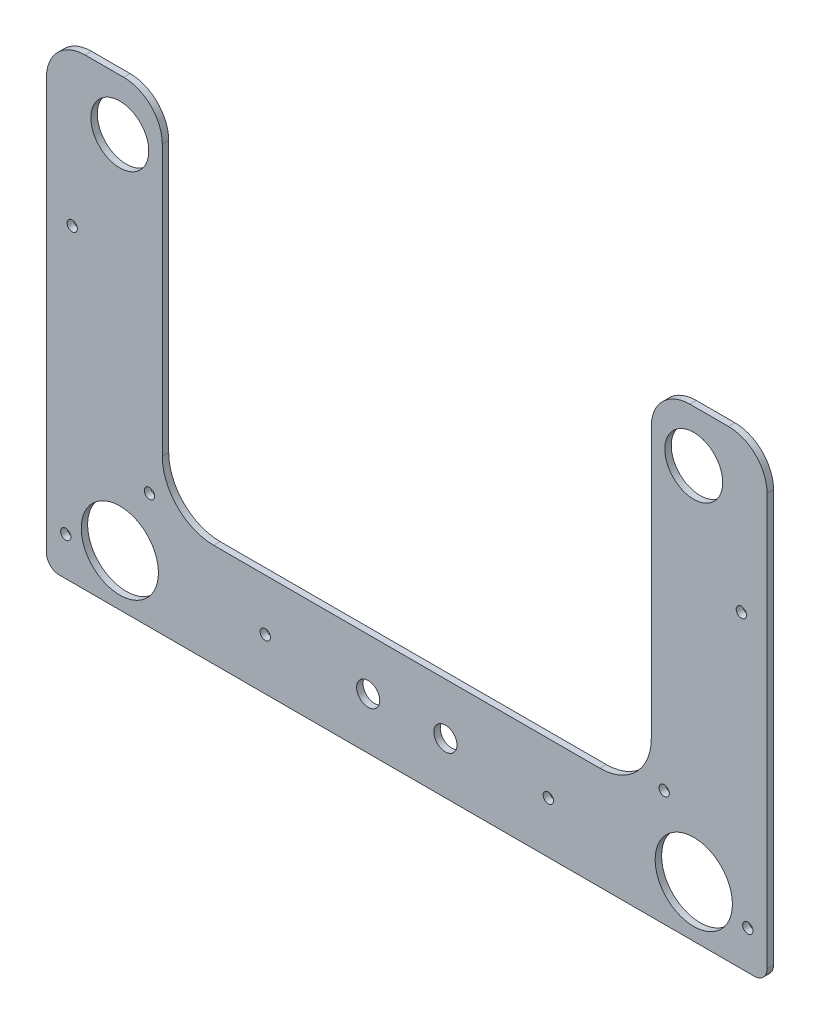
ISO-10303-21;
HEADER;
FILE_DESCRIPTION(('STEP AP214'),'2;1');
FILE_NAME('part.step','',(''),(''),'','','');
FILE_SCHEMA(('AUTOMOTIVE_DESIGN { 1 0 10303 214 1 1 1 1 }'));
ENDSEC;
DATA;
#1=APPLICATION_CONTEXT('core data for automotive mechanical design processes');
#2=APPLICATION_PROTOCOL_DEFINITION('international standard','automotive_design',2000,#1);
#3=PRODUCT_CONTEXT('',#1,'mechanical');
#4=PRODUCT('Part','Part','',(#3));
#5=PRODUCT_RELATED_PRODUCT_CATEGORY('part','',(#4));
#6=PRODUCT_DEFINITION_FORMATION('','',#4);
#7=PRODUCT_DEFINITION_CONTEXT('part definition',#1,'design');
#8=PRODUCT_DEFINITION('design','',#6,#7);
#9=PRODUCT_DEFINITION_SHAPE('','',#8);
#10=(LENGTH_UNIT() NAMED_UNIT(*) SI_UNIT(.MILLI.,.METRE.));
#11=(NAMED_UNIT(*) PLANE_ANGLE_UNIT() SI_UNIT($,.RADIAN.));
#12=(NAMED_UNIT(*) SI_UNIT($,.STERADIAN.) SOLID_ANGLE_UNIT());
#13=UNCERTAINTY_MEASURE_WITH_UNIT(LENGTH_MEASURE(1.E-05),#10,'distance_accuracy_value','');
#14=(GEOMETRIC_REPRESENTATION_CONTEXT(3) GLOBAL_UNCERTAINTY_ASSIGNED_CONTEXT((#13)) GLOBAL_UNIT_ASSIGNED_CONTEXT((#10,
#11,#12)) REPRESENTATION_CONTEXT('',''));
#15=CARTESIAN_POINT('',(0.,0.,0.));
#16=DIRECTION('',(0.,0.,1.));
#17=DIRECTION('',(1.,0.,0.));
#18=AXIS2_PLACEMENT_3D('',#15,#16,#17);
#19=CARTESIAN_POINT('',(165.1,6.35,3.175));
#20=DIRECTION('',(0.,0.,1.));
#21=DIRECTION('',(1.,0.,0.));
#22=AXIS2_PLACEMENT_3D('',#19,#20,#21);
#23=PLANE('',#22);
#24=DIRECTION('',(0.,1.,0.));
#25=VECTOR('',#24,1.);
#26=CARTESIAN_POINT('',(177.8,-6.35,3.175));
#27=LINE('',#26,#25);
#28=CARTESIAN_POINT('',(177.8,-222.25,3.175));
#29=VERTEX_POINT('',#28);
#30=CARTESIAN_POINT('',(177.8,-19.05,3.175));
#31=VERTEX_POINT('',#30);
#32=EDGE_CURVE('E165',#29,#31,#27,.T.);
#33=ORIENTED_EDGE('',*,*,#32,.T.);
#34=CARTESIAN_POINT('',(158.75,-19.05,3.175));
#35=DIRECTION('',(0.,0.,1.));
#36=DIRECTION('',(1.,0.,0.));
#37=AXIS2_PLACEMENT_3D('',#34,#35,#36);
#38=CIRCLE('',#37,19.05);
#39=CARTESIAN_POINT('',(158.75,0.,3.175));
#40=VERTEX_POINT('',#39);
#41=EDGE_CURVE('E279',#31,#40,#38,.T.);
#42=ORIENTED_EDGE('',*,*,#41,.T.);
#43=DIRECTION('',(1.,0.,0.));
#44=VECTOR('',#43,1.);
#45=CARTESIAN_POINT('',(-177.8,0.,3.175));
#46=LINE('',#45,#44);
#47=CARTESIAN_POINT('',(139.7,0.,3.175));
#48=VERTEX_POINT('',#47);
#49=EDGE_CURVE('E665',#48,#40,#46,.T.);
#50=ORIENTED_EDGE('',*,*,#49,.F.);
#51=CARTESIAN_POINT('',(139.7,-19.05,3.175));
#52=DIRECTION('',(0.,0.,1.));
#53=DIRECTION('',(1.,0.,0.));
#54=AXIS2_PLACEMENT_3D('',#51,#52,#53);
#55=CIRCLE('',#54,19.05);
#56=CARTESIAN_POINT('',(120.65,-19.0500000000001,3.175));
#57=VERTEX_POINT('',#56);
#58=EDGE_CURVE('E162',#48,#57,#55,.T.);
#59=ORIENTED_EDGE('',*,*,#58,.T.);
#60=DIRECTION('',(0.,-1.,0.));
#61=VECTOR('',#60,1.);
#62=CARTESIAN_POINT('',(120.65,6.35,3.175));
#63=LINE('',#62,#61);
#64=CARTESIAN_POINT('',(120.65,-152.4,3.175));
#65=VERTEX_POINT('',#64);
#66=EDGE_CURVE('E153',#57,#65,#63,.T.);
#67=ORIENTED_EDGE('',*,*,#66,.T.);
#68=CARTESIAN_POINT('',(95.25,-152.4,3.175));
#69=DIRECTION('',(0.,0.,-1.));
#70=DIRECTION('',(1.,0.,0.));
#71=AXIS2_PLACEMENT_3D('',#68,#69,#70);
#72=CIRCLE('',#71,25.4000000000002);
#73=CARTESIAN_POINT('',(95.25,-177.8,3.175));
#74=VERTEX_POINT('',#73);
#75=EDGE_CURVE('E158',#65,#74,#72,.T.);
#76=ORIENTED_EDGE('',*,*,#75,.T.);
#77=DIRECTION('',(-1.,0.,0.));
#78=VECTOR('',#77,1.);
#79=CARTESIAN_POINT('',(12.7,-177.8,3.175));
#80=LINE('',#79,#78);
#81=CARTESIAN_POINT('',(-95.25,-177.8,3.175));
#82=VERTEX_POINT('',#81);
#83=EDGE_CURVE('E183',#74,#82,#80,.T.);
#84=ORIENTED_EDGE('',*,*,#83,.T.);
#85=CARTESIAN_POINT('',(-95.25,-152.4,3.175));
#86=DIRECTION('',(0.,0.,-1.));
#87=DIRECTION('',(-1.,0.,0.));
#88=AXIS2_PLACEMENT_3D('',#85,#86,#87);
#89=CIRCLE('',#88,25.4);
#90=CARTESIAN_POINT('',(-120.65,-152.4,3.175));
#91=VERTEX_POINT('',#90);
#92=EDGE_CURVE('E186',#82,#91,#89,.T.);
#93=ORIENTED_EDGE('',*,*,#92,.T.);
#94=DIRECTION('',(0.,1.,0.));
#95=VECTOR('',#94,1.);
#96=CARTESIAN_POINT('',(-120.65,-152.4,3.175));
#97=LINE('',#96,#95);
#98=CARTESIAN_POINT('',(-120.65,-19.05,3.175));
#99=VERTEX_POINT('',#98);
#100=EDGE_CURVE('E192',#91,#99,#97,.T.);
#101=ORIENTED_EDGE('',*,*,#100,.T.);
#102=CARTESIAN_POINT('',(-139.7,-19.05,3.175));
#103=DIRECTION('',(0.,0.,1.));
#104=DIRECTION('',(1.,0.,0.));
#105=AXIS2_PLACEMENT_3D('',#102,#103,#104);
#106=CIRCLE('',#105,19.05);
#107=CARTESIAN_POINT('',(-139.7,0.,3.175));
#108=VERTEX_POINT('',#107);
#109=EDGE_CURVE('E274',#99,#108,#106,.T.);
#110=ORIENTED_EDGE('',*,*,#109,.T.);
#111=CARTESIAN_POINT('',(-158.75,0.,3.175));
#112=VERTEX_POINT('',#111);
#113=EDGE_CURVE('E317',#112,#108,#46,.T.);
#114=ORIENTED_EDGE('',*,*,#113,.F.);
#115=CARTESIAN_POINT('',(-158.75,-19.05,3.175));
#116=DIRECTION('',(0.,0.,1.));
#117=DIRECTION('',(1.,0.,0.));
#118=AXIS2_PLACEMENT_3D('',#115,#116,#117);
#119=CIRCLE('',#118,19.05);
#120=CARTESIAN_POINT('',(-177.8,-19.05,3.175));
#121=VERTEX_POINT('',#120);
#122=EDGE_CURVE('E271',#112,#121,#119,.T.);
#123=ORIENTED_EDGE('',*,*,#122,.T.);
#124=DIRECTION('',(0.,-1.,0.));
#125=VECTOR('',#124,1.);
#126=CARTESIAN_POINT('',(-177.8,-6.35,3.175));
#127=LINE('',#126,#125);
#128=CARTESIAN_POINT('',(-177.8,-222.25,3.175));
#129=VERTEX_POINT('',#128);
#130=EDGE_CURVE('E196',#121,#129,#127,.T.);
#131=ORIENTED_EDGE('',*,*,#130,.T.);
#132=CARTESIAN_POINT('',(-171.45,-222.25,3.175));
#133=DIRECTION('',(0.,0.,1.));
#134=DIRECTION('',(-1.,0.,0.));
#135=AXIS2_PLACEMENT_3D('',#132,#133,#134);
#136=CIRCLE('',#135,6.35000000000001);
#137=CARTESIAN_POINT('',(-171.45,-228.6,3.175));
#138=VERTEX_POINT('',#137);
#139=EDGE_CURVE('E199',#129,#138,#136,.T.);
#140=ORIENTED_EDGE('',*,*,#139,.T.);
#141=DIRECTION('',(1.,0.,0.));
#142=VECTOR('',#141,1.);
#143=CARTESIAN_POINT('',(-12.7,-228.6,3.175));
#144=LINE('',#143,#142);
#145=CARTESIAN_POINT('',(171.45,-228.6,3.175));
#146=VERTEX_POINT('',#145);
#147=EDGE_CURVE('E202',#138,#146,#144,.T.);
#148=ORIENTED_EDGE('',*,*,#147,.T.);
#149=CARTESIAN_POINT('',(171.45,-222.25,3.175));
#150=DIRECTION('',(0.,0.,1.));
#151=DIRECTION('',(1.,0.,0.));
#152=AXIS2_PLACEMENT_3D('',#149,#150,#151);
#153=CIRCLE('',#152,6.35000000000001);
#154=EDGE_CURVE('E205',#146,#29,#153,.T.);
#155=ORIENTED_EDGE('',*,*,#154,.T.);
#156=EDGE_LOOP('',(#33,#42,#50,#59,#67,#76,#84,#93,#101,#110,#114,#123,#131,#140,#148,#155));
#157=FACE_BOUND('',#156,.T.);
#158=CARTESIAN_POINT('',(165.1,-76.2,3.175));
#159=DIRECTION('',(0.,0.,1.));
#160=DIRECTION('',(-1.,0.,0.));
#161=AXIS2_PLACEMENT_3D('',#158,#159,#160);
#162=CIRCLE('',#161,2.53999999999998);
#163=CARTESIAN_POINT('',(162.56,-76.2,3.175));
#164=VERTEX_POINT('',#163);
#165=EDGE_CURVE('E671',#164,#164,#162,.T.);
#166=ORIENTED_EDGE('',*,*,#165,.F.);
#167=EDGE_LOOP('',(#166));
#168=FACE_BOUND('',#167,.T.);
#169=CARTESIAN_POINT('',(-165.1,-76.2,3.175));
#170=DIRECTION('',(0.,0.,1.));
#171=DIRECTION('',(1.,0.,0.));
#172=AXIS2_PLACEMENT_3D('',#169,#170,#171);
#173=CIRCLE('',#172,2.53999999999998);
#174=CARTESIAN_POINT('',(-162.56,-76.2,3.175));
#175=VERTEX_POINT('',#174);
#176=EDGE_CURVE('E679',#175,#175,#173,.T.);
#177=ORIENTED_EDGE('',*,*,#176,.F.);
#178=EDGE_LOOP('',(#177));
#179=FACE_BOUND('',#178,.T.);
#180=CARTESIAN_POINT('',(-19.05,-203.2,3.175));
#181=DIRECTION('',(0.,0.,1.));
#182=DIRECTION('',(1.,0.,0.));
#183=AXIS2_PLACEMENT_3D('',#180,#181,#182);
#184=CIRCLE('',#183,5.715);
#185=CARTESIAN_POINT('',(-13.335,-203.2,3.175));
#186=VERTEX_POINT('',#185);
#187=EDGE_CURVE('E695',#186,#186,#184,.T.);
#188=ORIENTED_EDGE('',*,*,#187,.F.);
#189=EDGE_LOOP('',(#188));
#190=FACE_BOUND('',#189,.T.);
#191=CARTESIAN_POINT('',(69.85,-203.2,3.175));
#192=DIRECTION('',(0.,0.,1.));
#193=DIRECTION('',(-1.,0.,0.));
#194=AXIS2_PLACEMENT_3D('',#191,#192,#193);
#195=CIRCLE('',#194,2.54000000000002);
#196=CARTESIAN_POINT('',(67.31,-203.2,3.175));
#197=VERTEX_POINT('',#196);
#198=EDGE_CURVE('E711',#197,#197,#195,.T.);
#199=ORIENTED_EDGE('',*,*,#198,.F.);
#200=EDGE_LOOP('',(#199));
#201=FACE_BOUND('',#200,.T.);
#202=CARTESIAN_POINT('',(19.05,-203.2,3.175));
#203=DIRECTION('',(0.,0.,1.));
#204=DIRECTION('',(-1.,0.,0.));
#205=AXIS2_PLACEMENT_3D('',#202,#203,#204);
#206=CIRCLE('',#205,5.715);
#207=CARTESIAN_POINT('',(13.335,-203.2,3.175));
#208=VERTEX_POINT('',#207);
#209=EDGE_CURVE('E727',#208,#208,#206,.T.);
#210=ORIENTED_EDGE('',*,*,#209,.F.);
#211=EDGE_LOOP('',(#210));
#212=FACE_BOUND('',#211,.T.);
#213=CARTESIAN_POINT('',(-141.605,-25.4,3.175));
#214=DIRECTION('',(0.,0.,1.));
#215=DIRECTION('',(-1.,0.,0.));
#216=AXIS2_PLACEMENT_3D('',#213,#214,#215);
#217=CIRCLE('',#216,14.2875);
#218=CARTESIAN_POINT('',(-155.8925,-25.4,3.175));
#219=VERTEX_POINT('',#218);
#220=EDGE_CURVE('E743',#219,#219,#217,.T.);
#221=ORIENTED_EDGE('',*,*,#220,.F.);
#222=EDGE_LOOP('',(#221));
#223=FACE_BOUND('',#222,.T.);
#224=CARTESIAN_POINT('',(141.605,-25.4,3.175));
#225=DIRECTION('',(0.,0.,1.));
#226=DIRECTION('',(1.,0.,0.));
#227=AXIS2_PLACEMENT_3D('',#224,#225,#226);
#228=CIRCLE('',#227,14.2875);
#229=CARTESIAN_POINT('',(155.8925,-25.4,3.175));
#230=VERTEX_POINT('',#229);
#231=EDGE_CURVE('E759',#230,#230,#228,.T.);
#232=ORIENTED_EDGE('',*,*,#231,.F.);
#233=EDGE_LOOP('',(#232));
#234=FACE_BOUND('',#233,.T.);
#235=CARTESIAN_POINT('',(-141.604999999999,-203.200000000001,3.175));
#236=DIRECTION('',(0.,0.,1.));
#237=DIRECTION('',(1.,0.,0.));
#238=AXIS2_PLACEMENT_3D('',#235,#236,#237);
#239=CIRCLE('',#238,19.05);
#240=CARTESIAN_POINT('',(-122.554999999999,-203.200000000001,3.175));
#241=VERTEX_POINT('',#240);
#242=EDGE_CURVE('E213',#241,#241,#239,.T.);
#243=ORIENTED_EDGE('',*,*,#242,.F.);
#244=EDGE_LOOP('',(#243));
#245=FACE_BOUND('',#244,.T.);
#246=CARTESIAN_POINT('',(127.,-171.45,3.175));
#247=DIRECTION('',(0.,0.,1.));
#248=DIRECTION('',(-1.,0.,0.));
#249=AXIS2_PLACEMENT_3D('',#246,#247,#248);
#250=CIRCLE('',#249,2.53999999999998);
#251=CARTESIAN_POINT('',(124.46,-171.45,3.175));
#252=VERTEX_POINT('',#251);
#253=EDGE_CURVE('E767',#252,#252,#250,.T.);
#254=ORIENTED_EDGE('',*,*,#253,.F.);
#255=EDGE_LOOP('',(#254));
#256=FACE_BOUND('',#255,.T.);
#257=CARTESIAN_POINT('',(-69.85,-203.2,3.175));
#258=DIRECTION('',(0.,0.,1.));
#259=DIRECTION('',(1.,0.,0.));
#260=AXIS2_PLACEMENT_3D('',#257,#258,#259);
#261=CIRCLE('',#260,2.54000000000002);
#262=CARTESIAN_POINT('',(-67.31,-203.2,3.175));
#263=VERTEX_POINT('',#262);
#264=EDGE_CURVE('E751',#263,#263,#261,.T.);
#265=ORIENTED_EDGE('',*,*,#264,.F.);
#266=EDGE_LOOP('',(#265));
#267=FACE_BOUND('',#266,.T.);
#268=CARTESIAN_POINT('',(-127.,-171.45,3.175));
#269=DIRECTION('',(0.,0.,1.));
#270=DIRECTION('',(1.,0.,0.));
#271=AXIS2_PLACEMENT_3D('',#268,#269,#270);
#272=CIRCLE('',#271,2.53999999999998);
#273=CARTESIAN_POINT('',(-124.46,-171.45,3.175));
#274=VERTEX_POINT('',#273);
#275=EDGE_CURVE('E735',#274,#274,#272,.T.);
#276=ORIENTED_EDGE('',*,*,#275,.F.);
#277=EDGE_LOOP('',(#276));
#278=FACE_BOUND('',#277,.T.);
#279=CARTESIAN_POINT('',(141.605,-203.2,3.175));
#280=DIRECTION('',(0.,0.,1.));
#281=DIRECTION('',(-1.,0.,0.));
#282=AXIS2_PLACEMENT_3D('',#279,#280,#281);
#283=CIRCLE('',#282,19.05);
#284=CARTESIAN_POINT('',(122.555,-203.2,3.175));
#285=VERTEX_POINT('',#284);
#286=EDGE_CURVE('E719',#285,#285,#283,.T.);
#287=ORIENTED_EDGE('',*,*,#286,.F.);
#288=EDGE_LOOP('',(#287));
#289=FACE_BOUND('',#288,.T.);
#290=CARTESIAN_POINT('',(-168.275,-209.55,3.175));
#291=DIRECTION('',(0.,0.,1.));
#292=DIRECTION('',(1.,0.,0.));
#293=AXIS2_PLACEMENT_3D('',#290,#291,#292);
#294=CIRCLE('',#293,2.53999999999998);
#295=CARTESIAN_POINT('',(-165.735,-209.55,3.175));
#296=VERTEX_POINT('',#295);
#297=EDGE_CURVE('E703',#296,#296,#294,.T.);
#298=ORIENTED_EDGE('',*,*,#297,.F.);
#299=EDGE_LOOP('',(#298));
#300=FACE_BOUND('',#299,.T.);
#301=CARTESIAN_POINT('',(168.275,-209.55,3.175));
#302=DIRECTION('',(0.,0.,1.));
#303=DIRECTION('',(-1.,0.,0.));
#304=AXIS2_PLACEMENT_3D('',#301,#302,#303);
#305=CIRCLE('',#304,2.53999999999998);
#306=CARTESIAN_POINT('',(165.735,-209.55,3.175));
#307=VERTEX_POINT('',#306);
#308=EDGE_CURVE('E687',#307,#307,#305,.T.);
#309=ORIENTED_EDGE('',*,*,#308,.F.);
#310=EDGE_LOOP('',(#309));
#311=FACE_BOUND('',#310,.T.);
#312=ADVANCED_FACE('F39',(#157,#168,#179,#190,#201,#212,#223,#234,#245,#256,#267,#278,#289,#300,
#311),#23,.T.);
#313=CARTESIAN_POINT('',(165.1,6.35,0.));
#314=DIRECTION('',(0.,0.,1.));
#315=DIRECTION('',(1.,0.,0.));
#316=AXIS2_PLACEMENT_3D('',#313,#314,#315);
#317=PLANE('',#316);
#318=DIRECTION('',(1.,0.,0.));
#319=VECTOR('',#318,1.);
#320=CARTESIAN_POINT('',(-177.8,0.,0.));
#321=LINE('',#320,#319);
#322=CARTESIAN_POINT('',(139.7,0.,0.));
#323=VERTEX_POINT('',#322);
#324=CARTESIAN_POINT('',(158.75,0.,0.));
#325=VERTEX_POINT('',#324);
#326=EDGE_CURVE('E326',#323,#325,#321,.T.);
#327=ORIENTED_EDGE('',*,*,#326,.T.);
#328=CARTESIAN_POINT('',(158.75,-19.05,0.));
#329=DIRECTION('',(0.,0.,1.));
#330=DIRECTION('',(1.,0.,0.));
#331=AXIS2_PLACEMENT_3D('',#328,#329,#330);
#332=CIRCLE('',#331,19.05);
#333=CARTESIAN_POINT('',(177.8,-19.05,0.));
#334=VERTEX_POINT('',#333);
#335=EDGE_CURVE('E295',#325,#334,#332,.F.);
#336=ORIENTED_EDGE('',*,*,#335,.T.);
#337=DIRECTION('',(0.,1.,0.));
#338=VECTOR('',#337,1.);
#339=CARTESIAN_POINT('',(177.8,-6.35,0.));
#340=LINE('',#339,#338);
#341=CARTESIAN_POINT('',(177.8,-222.25,0.));
#342=VERTEX_POINT('',#341);
#343=EDGE_CURVE('E239',#342,#334,#340,.T.);
#344=ORIENTED_EDGE('',*,*,#343,.F.);
#345=CARTESIAN_POINT('',(171.45,-222.25,0.));
#346=DIRECTION('',(0.,0.,1.));
#347=DIRECTION('',(1.,0.,0.));
#348=AXIS2_PLACEMENT_3D('',#345,#346,#347);
#349=CIRCLE('',#348,6.35000000000001);
#350=CARTESIAN_POINT('',(171.45,-228.6,0.));
#351=VERTEX_POINT('',#350);
#352=EDGE_CURVE('E236',#351,#342,#349,.T.);
#353=ORIENTED_EDGE('',*,*,#352,.F.);
#354=DIRECTION('',(1.,0.,0.));
#355=VECTOR('',#354,1.);
#356=CARTESIAN_POINT('',(12.7,-228.6,0.));
#357=LINE('',#356,#355);
#358=CARTESIAN_POINT('',(-171.45,-228.6,0.));
#359=VERTEX_POINT('',#358);
#360=EDGE_CURVE('E233',#359,#351,#357,.T.);
#361=ORIENTED_EDGE('',*,*,#360,.F.);
#362=CARTESIAN_POINT('',(-171.45,-222.25,0.));
#363=DIRECTION('',(0.,0.,1.));
#364=DIRECTION('',(-1.,0.,0.));
#365=AXIS2_PLACEMENT_3D('',#362,#363,#364);
#366=CIRCLE('',#365,6.35000000000001);
#367=CARTESIAN_POINT('',(-177.8,-222.25,0.));
#368=VERTEX_POINT('',#367);
#369=EDGE_CURVE('E229',#368,#359,#366,.T.);
#370=ORIENTED_EDGE('',*,*,#369,.F.);
#371=DIRECTION('',(0.,-1.,0.));
#372=VECTOR('',#371,1.);
#373=CARTESIAN_POINT('',(-177.8,-6.35,0.));
#374=LINE('',#373,#372);
#375=CARTESIAN_POINT('',(-177.8,-19.05,0.));
#376=VERTEX_POINT('',#375);
#377=EDGE_CURVE('E226',#376,#368,#374,.T.);
#378=ORIENTED_EDGE('',*,*,#377,.F.);
#379=CARTESIAN_POINT('',(-158.75,-19.05,0.));
#380=DIRECTION('',(0.,0.,1.));
#381=DIRECTION('',(1.,0.,0.));
#382=AXIS2_PLACEMENT_3D('',#379,#380,#381);
#383=CIRCLE('',#382,19.05);
#384=CARTESIAN_POINT('',(-158.75,0.,0.));
#385=VERTEX_POINT('',#384);
#386=EDGE_CURVE('E288',#376,#385,#383,.F.);
#387=ORIENTED_EDGE('',*,*,#386,.T.);
#388=CARTESIAN_POINT('',(-139.7,0.,0.));
#389=VERTEX_POINT('',#388);
#390=EDGE_CURVE('E314',#385,#389,#321,.T.);
#391=ORIENTED_EDGE('',*,*,#390,.T.);
#392=CARTESIAN_POINT('',(-139.7,-19.05,0.));
#393=DIRECTION('',(0.,0.,1.));
#394=DIRECTION('',(1.,0.,0.));
#395=AXIS2_PLACEMENT_3D('',#392,#393,#394);
#396=CIRCLE('',#395,19.05);
#397=CARTESIAN_POINT('',(-120.65,-19.05,0.));
#398=VERTEX_POINT('',#397);
#399=EDGE_CURVE('E63',#389,#398,#396,.F.);
#400=ORIENTED_EDGE('',*,*,#399,.T.);
#401=DIRECTION('',(0.,1.,0.));
#402=VECTOR('',#401,1.);
#403=CARTESIAN_POINT('',(-120.65,6.35,0.));
#404=LINE('',#403,#402);
#405=CARTESIAN_POINT('',(-120.65,-152.4,0.));
#406=VERTEX_POINT('',#405);
#407=EDGE_CURVE('E223',#406,#398,#404,.T.);
#408=ORIENTED_EDGE('',*,*,#407,.F.);
#409=CARTESIAN_POINT('',(-95.25,-152.4,0.));
#410=DIRECTION('',(0.,0.,-1.));
#411=DIRECTION('',(-1.,0.,0.));
#412=AXIS2_PLACEMENT_3D('',#409,#410,#411);
#413=CIRCLE('',#412,25.4);
#414=CARTESIAN_POINT('',(-95.25,-177.8,0.));
#415=VERTEX_POINT('',#414);
#416=EDGE_CURVE('E219',#415,#406,#413,.T.);
#417=ORIENTED_EDGE('',*,*,#416,.F.);
#418=DIRECTION('',(-1.,0.,0.));
#419=VECTOR('',#418,1.);
#420=CARTESIAN_POINT('',(-12.7,-177.8,0.));
#421=LINE('',#420,#419);
#422=CARTESIAN_POINT('',(95.25,-177.8,0.));
#423=VERTEX_POINT('',#422);
#424=EDGE_CURVE('E216',#423,#415,#421,.T.);
#425=ORIENTED_EDGE('',*,*,#424,.F.);
#426=CARTESIAN_POINT('',(95.25,-152.4,0.));
#427=DIRECTION('',(0.,0.,-1.));
#428=DIRECTION('',(1.,0.,0.));
#429=AXIS2_PLACEMENT_3D('',#426,#427,#428);
#430=CIRCLE('',#429,25.4000000000002);
#431=CARTESIAN_POINT('',(120.65,-152.4,0.));
#432=VERTEX_POINT('',#431);
#433=EDGE_CURVE('E212',#432,#423,#430,.T.);
#434=ORIENTED_EDGE('',*,*,#433,.F.);
#435=DIRECTION('',(0.,-1.,0.));
#436=VECTOR('',#435,1.);
#437=CARTESIAN_POINT('',(120.65,-152.4,0.));
#438=LINE('',#437,#436);
#439=CARTESIAN_POINT('',(120.65,-19.0500000000001,0.));
#440=VERTEX_POINT('',#439);
#441=EDGE_CURVE('E171',#440,#432,#438,.T.);
#442=ORIENTED_EDGE('',*,*,#441,.F.);
#443=CARTESIAN_POINT('',(139.7,-19.05,0.));
#444=DIRECTION('',(0.,0.,1.));
#445=DIRECTION('',(1.,0.,0.));
#446=AXIS2_PLACEMENT_3D('',#443,#444,#445);
#447=CIRCLE('',#446,19.05);
#448=EDGE_CURVE('E55',#440,#323,#447,.F.);
#449=ORIENTED_EDGE('',*,*,#448,.T.);
#450=EDGE_LOOP('',(#327,#336,#344,#353,#361,#370,#378,#387,#391,#400,#408,#417,#425,#434,#442,#449));
#451=FACE_BOUND('',#450,.T.);
#452=CARTESIAN_POINT('',(-141.604999999999,-203.200000000001,0.));
#453=DIRECTION('',(0.,0.,1.));
#454=DIRECTION('',(1.,0.,0.));
#455=AXIS2_PLACEMENT_3D('',#452,#453,#454);
#456=CIRCLE('',#455,19.05);
#457=CARTESIAN_POINT('',(-122.554999999999,-203.200000000001,0.));
#458=VERTEX_POINT('',#457);
#459=EDGE_CURVE('E771',#458,#458,#456,.T.);
#460=ORIENTED_EDGE('',*,*,#459,.T.);
#461=EDGE_LOOP('',(#460));
#462=FACE_BOUND('',#461,.T.);
#463=CARTESIAN_POINT('',(127.,-171.45,0.));
#464=DIRECTION('',(0.,0.,1.));
#465=DIRECTION('',(-1.,0.,0.));
#466=AXIS2_PLACEMENT_3D('',#463,#464,#465);
#467=CIRCLE('',#466,2.53999999999998);
#468=CARTESIAN_POINT('',(124.46,-171.45,0.));
#469=VERTEX_POINT('',#468);
#470=EDGE_CURVE('E763',#469,#469,#467,.T.);
#471=ORIENTED_EDGE('',*,*,#470,.T.);
#472=EDGE_LOOP('',(#471));
#473=FACE_BOUND('',#472,.T.);
#474=CARTESIAN_POINT('',(141.605,-25.4,0.));
#475=DIRECTION('',(0.,0.,1.));
#476=DIRECTION('',(1.,0.,0.));
#477=AXIS2_PLACEMENT_3D('',#474,#475,#476);
#478=CIRCLE('',#477,14.2875);
#479=CARTESIAN_POINT('',(155.8925,-25.4,0.));
#480=VERTEX_POINT('',#479);
#481=EDGE_CURVE('E755',#480,#480,#478,.T.);
#482=ORIENTED_EDGE('',*,*,#481,.T.);
#483=EDGE_LOOP('',(#482));
#484=FACE_BOUND('',#483,.T.);
#485=CARTESIAN_POINT('',(-69.85,-203.2,0.));
#486=DIRECTION('',(0.,0.,1.));
#487=DIRECTION('',(1.,0.,0.));
#488=AXIS2_PLACEMENT_3D('',#485,#486,#487);
#489=CIRCLE('',#488,2.54000000000002);
#490=CARTESIAN_POINT('',(-67.31,-203.2,0.));
#491=VERTEX_POINT('',#490);
#492=EDGE_CURVE('E747',#491,#491,#489,.T.);
#493=ORIENTED_EDGE('',*,*,#492,.T.);
#494=EDGE_LOOP('',(#493));
#495=FACE_BOUND('',#494,.T.);
#496=CARTESIAN_POINT('',(-141.605,-25.4,0.));
#497=DIRECTION('',(0.,0.,1.));
#498=DIRECTION('',(-1.,0.,0.));
#499=AXIS2_PLACEMENT_3D('',#496,#497,#498);
#500=CIRCLE('',#499,14.2875);
#501=CARTESIAN_POINT('',(-155.8925,-25.4,0.));
#502=VERTEX_POINT('',#501);
#503=EDGE_CURVE('E739',#502,#502,#500,.T.);
#504=ORIENTED_EDGE('',*,*,#503,.T.);
#505=EDGE_LOOP('',(#504));
#506=FACE_BOUND('',#505,.T.);
#507=CARTESIAN_POINT('',(-127.,-171.45,0.));
#508=DIRECTION('',(0.,0.,1.));
#509=DIRECTION('',(1.,0.,0.));
#510=AXIS2_PLACEMENT_3D('',#507,#508,#509);
#511=CIRCLE('',#510,2.53999999999998);
#512=CARTESIAN_POINT('',(-124.46,-171.45,0.));
#513=VERTEX_POINT('',#512);
#514=EDGE_CURVE('E731',#513,#513,#511,.T.);
#515=ORIENTED_EDGE('',*,*,#514,.T.);
#516=EDGE_LOOP('',(#515));
#517=FACE_BOUND('',#516,.T.);
#518=CARTESIAN_POINT('',(19.05,-203.2,0.));
#519=DIRECTION('',(0.,0.,1.));
#520=DIRECTION('',(-1.,0.,0.));
#521=AXIS2_PLACEMENT_3D('',#518,#519,#520);
#522=CIRCLE('',#521,5.715);
#523=CARTESIAN_POINT('',(13.335,-203.2,0.));
#524=VERTEX_POINT('',#523);
#525=EDGE_CURVE('E723',#524,#524,#522,.T.);
#526=ORIENTED_EDGE('',*,*,#525,.T.);
#527=EDGE_LOOP('',(#526));
#528=FACE_BOUND('',#527,.T.);
#529=CARTESIAN_POINT('',(141.605,-203.2,0.));
#530=DIRECTION('',(0.,0.,1.));
#531=DIRECTION('',(-1.,0.,0.));
#532=AXIS2_PLACEMENT_3D('',#529,#530,#531);
#533=CIRCLE('',#532,19.05);
#534=CARTESIAN_POINT('',(122.555,-203.2,0.));
#535=VERTEX_POINT('',#534);
#536=EDGE_CURVE('E715',#535,#535,#533,.T.);
#537=ORIENTED_EDGE('',*,*,#536,.T.);
#538=EDGE_LOOP('',(#537));
#539=FACE_BOUND('',#538,.T.);
#540=CARTESIAN_POINT('',(69.85,-203.2,0.));
#541=DIRECTION('',(0.,0.,1.));
#542=DIRECTION('',(-1.,0.,0.));
#543=AXIS2_PLACEMENT_3D('',#540,#541,#542);
#544=CIRCLE('',#543,2.54000000000002);
#545=CARTESIAN_POINT('',(67.31,-203.2,0.));
#546=VERTEX_POINT('',#545);
#547=EDGE_CURVE('E707',#546,#546,#544,.T.);
#548=ORIENTED_EDGE('',*,*,#547,.T.);
#549=EDGE_LOOP('',(#548));
#550=FACE_BOUND('',#549,.T.);
#551=CARTESIAN_POINT('',(-168.275,-209.55,0.));
#552=DIRECTION('',(0.,0.,1.));
#553=DIRECTION('',(1.,0.,0.));
#554=AXIS2_PLACEMENT_3D('',#551,#552,#553);
#555=CIRCLE('',#554,2.53999999999998);
#556=CARTESIAN_POINT('',(-165.735,-209.55,0.));
#557=VERTEX_POINT('',#556);
#558=EDGE_CURVE('E699',#557,#557,#555,.T.);
#559=ORIENTED_EDGE('',*,*,#558,.T.);
#560=EDGE_LOOP('',(#559));
#561=FACE_BOUND('',#560,.T.);
#562=CARTESIAN_POINT('',(-19.05,-203.2,0.));
#563=DIRECTION('',(0.,0.,1.));
#564=DIRECTION('',(1.,0.,0.));
#565=AXIS2_PLACEMENT_3D('',#562,#563,#564);
#566=CIRCLE('',#565,5.715);
#567=CARTESIAN_POINT('',(-13.335,-203.2,0.));
#568=VERTEX_POINT('',#567);
#569=EDGE_CURVE('E691',#568,#568,#566,.T.);
#570=ORIENTED_EDGE('',*,*,#569,.T.);
#571=EDGE_LOOP('',(#570));
#572=FACE_BOUND('',#571,.T.);
#573=CARTESIAN_POINT('',(168.275,-209.55,0.));
#574=DIRECTION('',(0.,0.,1.));
#575=DIRECTION('',(-1.,0.,0.));
#576=AXIS2_PLACEMENT_3D('',#573,#574,#575);
#577=CIRCLE('',#576,2.53999999999998);
#578=CARTESIAN_POINT('',(165.735,-209.55,0.));
#579=VERTEX_POINT('',#578);
#580=EDGE_CURVE('E683',#579,#579,#577,.T.);
#581=ORIENTED_EDGE('',*,*,#580,.T.);
#582=EDGE_LOOP('',(#581));
#583=FACE_BOUND('',#582,.T.);
#584=CARTESIAN_POINT('',(-165.1,-76.2,0.));
#585=DIRECTION('',(0.,0.,1.));
#586=DIRECTION('',(1.,0.,0.));
#587=AXIS2_PLACEMENT_3D('',#584,#585,#586);
#588=CIRCLE('',#587,2.53999999999998);
#589=CARTESIAN_POINT('',(-162.56,-76.2,0.));
#590=VERTEX_POINT('',#589);
#591=EDGE_CURVE('E675',#590,#590,#588,.T.);
#592=ORIENTED_EDGE('',*,*,#591,.T.);
#593=EDGE_LOOP('',(#592));
#594=FACE_BOUND('',#593,.T.);
#595=CARTESIAN_POINT('',(165.1,-76.2,0.));
#596=DIRECTION('',(0.,0.,1.));
#597=DIRECTION('',(-1.,0.,0.));
#598=AXIS2_PLACEMENT_3D('',#595,#596,#597);
#599=CIRCLE('',#598,2.53999999999998);
#600=CARTESIAN_POINT('',(162.56,-76.2,0.));
#601=VERTEX_POINT('',#600);
#602=EDGE_CURVE('E325',#601,#601,#599,.T.);
#603=ORIENTED_EDGE('',*,*,#602,.T.);
#604=EDGE_LOOP('',(#603));
#605=FACE_BOUND('',#604,.T.);
#606=ADVANCED_FACE('F320',(#451,#462,#473,#484,#495,#506,#517,#528,#539,#550,#561,#572,#583,
#594,#605),#317,.F.);
#607=CARTESIAN_POINT('',(120.65,-152.4,3.175));
#608=DIRECTION('',(1.,0.,0.));
#609=DIRECTION('',(0.,1.,0.));
#610=AXIS2_PLACEMENT_3D('',#607,#608,#609);
#611=PLANE('',#610);
#612=ORIENTED_EDGE('',*,*,#66,.F.);
#613=DIRECTION('',(0.,0.,-1.));
#614=VECTOR('',#613,1.);
#615=CARTESIAN_POINT('',(120.65,-19.0500000000001,3.175));
#616=LINE('',#615,#614);
#617=EDGE_CURVE('E298',#57,#440,#616,.T.);
#618=ORIENTED_EDGE('',*,*,#617,.T.);
#619=ORIENTED_EDGE('',*,*,#441,.T.);
#620=DIRECTION('',(0.,0.,-1.));
#621=VECTOR('',#620,1.);
#622=CARTESIAN_POINT('',(120.65,-152.4,3.175));
#623=LINE('',#622,#621);
#624=EDGE_CURVE('E168',#65,#432,#623,.T.);
#625=ORIENTED_EDGE('',*,*,#624,.F.);
#626=EDGE_LOOP('',(#612,#618,#619,#625));
#627=FACE_BOUND('',#626,.T.);
#628=ADVANCED_FACE('F169',(#627),#611,.F.);
#629=CARTESIAN_POINT('',(95.25,-152.4,3.175));
#630=DIRECTION('',(0.,0.,-1.));
#631=DIRECTION('',(-1.,0.,0.));
#632=AXIS2_PLACEMENT_3D('',#629,#630,#631);
#633=CYLINDRICAL_SURFACE('',#632,25.4000000000002);
#634=ORIENTED_EDGE('',*,*,#433,.T.);
#635=DIRECTION('',(0.,0.,-1.));
#636=VECTOR('',#635,1.);
#637=CARTESIAN_POINT('',(95.25,-177.8,3.175));
#638=LINE('',#637,#636);
#639=EDGE_CURVE('E177',#74,#423,#638,.T.);
#640=ORIENTED_EDGE('',*,*,#639,.F.);
#641=ORIENTED_EDGE('',*,*,#75,.F.);
#642=ORIENTED_EDGE('',*,*,#624,.T.);
#643=EDGE_LOOP('',(#634,#640,#641,#642));
#644=FACE_BOUND('',#643,.T.);
#645=ADVANCED_FACE('F179',(#644),#633,.F.);
#646=CARTESIAN_POINT('',(-12.7,-177.8,3.175));
#647=DIRECTION('',(0.,-1.,0.));
#648=DIRECTION('',(0.,0.,-1.));
#649=AXIS2_PLACEMENT_3D('',#646,#647,#648);
#650=PLANE('',#649);
#651=ORIENTED_EDGE('',*,*,#424,.T.);
#652=DIRECTION('',(0.,0.,-1.));
#653=VECTOR('',#652,1.);
#654=CARTESIAN_POINT('',(-95.25,-177.8,3.175));
#655=LINE('',#654,#653);
#656=EDGE_CURVE('E262',#82,#415,#655,.T.);
#657=ORIENTED_EDGE('',*,*,#656,.F.);
#658=ORIENTED_EDGE('',*,*,#83,.F.);
#659=ORIENTED_EDGE('',*,*,#639,.T.);
#660=EDGE_LOOP('',(#651,#657,#658,#659));
#661=FACE_BOUND('',#660,.T.);
#662=ADVANCED_FACE('F340',(#661),#650,.F.);
#663=CARTESIAN_POINT('',(-95.25,-152.4,3.175));
#664=DIRECTION('',(0.,0.,-1.));
#665=DIRECTION('',(-1.,0.,0.));
#666=AXIS2_PLACEMENT_3D('',#663,#664,#665);
#667=CYLINDRICAL_SURFACE('',#666,25.4);
#668=ORIENTED_EDGE('',*,*,#416,.T.);
#669=DIRECTION('',(0.,0.,-1.));
#670=VECTOR('',#669,1.);
#671=CARTESIAN_POINT('',(-120.65,-152.4,3.175));
#672=LINE('',#671,#670);
#673=EDGE_CURVE('E258',#91,#406,#672,.T.);
#674=ORIENTED_EDGE('',*,*,#673,.F.);
#675=ORIENTED_EDGE('',*,*,#92,.F.);
#676=ORIENTED_EDGE('',*,*,#656,.T.);
#677=EDGE_LOOP('',(#668,#674,#675,#676));
#678=FACE_BOUND('',#677,.T.);
#679=ADVANCED_FACE('F337',(#678),#667,.F.);
#680=CARTESIAN_POINT('',(-120.65,6.35,3.175));
#681=DIRECTION('',(-1.,0.,0.));
#682=DIRECTION('',(0.,-1.,0.));
#683=AXIS2_PLACEMENT_3D('',#680,#681,#682);
#684=PLANE('',#683);
#685=ORIENTED_EDGE('',*,*,#407,.T.);
#686=DIRECTION('',(0.,0.,1.));
#687=VECTOR('',#686,1.);
#688=CARTESIAN_POINT('',(-120.65,-19.05,3.175));
#689=LINE('',#688,#687);
#690=EDGE_CURVE('E301',#398,#99,#689,.T.);
#691=ORIENTED_EDGE('',*,*,#690,.T.);
#692=ORIENTED_EDGE('',*,*,#100,.F.);
#693=ORIENTED_EDGE('',*,*,#673,.T.);
#694=EDGE_LOOP('',(#685,#691,#692,#693));
#695=FACE_BOUND('',#694,.T.);
#696=ADVANCED_FACE('F332',(#695),#684,.F.);
#697=CARTESIAN_POINT('',(-177.8,-6.35,3.175));
#698=DIRECTION('',(1.,0.,0.));
#699=DIRECTION('',(0.,1.,0.));
#700=AXIS2_PLACEMENT_3D('',#697,#698,#699);
#701=PLANE('',#700);
#702=ORIENTED_EDGE('',*,*,#130,.F.);
#703=DIRECTION('',(0.,0.,1.));
#704=VECTOR('',#703,1.);
#705=CARTESIAN_POINT('',(-177.8,-19.05,3.175));
#706=LINE('',#705,#704);
#707=EDGE_CURVE('E11',#121,#376,#706,.F.);
#708=ORIENTED_EDGE('',*,*,#707,.T.);
#709=ORIENTED_EDGE('',*,*,#377,.T.);
#710=DIRECTION('',(0.,0.,-1.));
#711=VECTOR('',#710,1.);
#712=CARTESIAN_POINT('',(-177.8,-222.25,3.175));
#713=LINE('',#712,#711);
#714=EDGE_CURVE('E254',#129,#368,#713,.T.);
#715=ORIENTED_EDGE('',*,*,#714,.F.);
#716=EDGE_LOOP('',(#702,#708,#709,#715));
#717=FACE_BOUND('',#716,.T.);
#718=ADVANCED_FACE('F374',(#717),#701,.F.);
#719=CARTESIAN_POINT('',(-171.45,-222.25,3.175));
#720=DIRECTION('',(0.,0.,-1.));
#721=DIRECTION('',(-1.,0.,0.));
#722=AXIS2_PLACEMENT_3D('',#719,#720,#721);
#723=CYLINDRICAL_SURFACE('',#722,6.35000000000001);
#724=ORIENTED_EDGE('',*,*,#369,.T.);
#725=DIRECTION('',(0.,0.,-1.));
#726=VECTOR('',#725,1.);
#727=CARTESIAN_POINT('',(-171.45,-228.6,3.175));
#728=LINE('',#727,#726);
#729=EDGE_CURVE('E250',#138,#359,#728,.T.);
#730=ORIENTED_EDGE('',*,*,#729,.F.);
#731=ORIENTED_EDGE('',*,*,#139,.F.);
#732=ORIENTED_EDGE('',*,*,#714,.T.);
#733=EDGE_LOOP('',(#724,#730,#731,#732));
#734=FACE_BOUND('',#733,.T.);
#735=ADVANCED_FACE('F370',(#734),#723,.T.);
#736=CARTESIAN_POINT('',(12.7,-228.6,3.175));
#737=DIRECTION('',(0.,1.,0.));
#738=DIRECTION('',(-1.,0.,0.));
#739=AXIS2_PLACEMENT_3D('',#736,#737,#738);
#740=PLANE('',#739);
#741=ORIENTED_EDGE('',*,*,#360,.T.);
#742=DIRECTION('',(0.,0.,-1.));
#743=VECTOR('',#742,1.);
#744=CARTESIAN_POINT('',(171.45,-228.6,3.175));
#745=LINE('',#744,#743);
#746=EDGE_CURVE('E246',#146,#351,#745,.T.);
#747=ORIENTED_EDGE('',*,*,#746,.F.);
#748=ORIENTED_EDGE('',*,*,#147,.F.);
#749=ORIENTED_EDGE('',*,*,#729,.T.);
#750=EDGE_LOOP('',(#741,#747,#748,#749));
#751=FACE_BOUND('',#750,.T.);
#752=ADVANCED_FACE('F366',(#751),#740,.F.);
#753=CARTESIAN_POINT('',(171.45,-222.25,3.175));
#754=DIRECTION('',(0.,0.,-1.));
#755=DIRECTION('',(-1.,0.,0.));
#756=AXIS2_PLACEMENT_3D('',#753,#754,#755);
#757=CYLINDRICAL_SURFACE('',#756,6.35000000000001);
#758=ORIENTED_EDGE('',*,*,#352,.T.);
#759=DIRECTION('',(0.,0.,-1.));
#760=VECTOR('',#759,1.);
#761=CARTESIAN_POINT('',(177.8,-222.25,3.175));
#762=LINE('',#761,#760);
#763=EDGE_CURVE('E209',#29,#342,#762,.T.);
#764=ORIENTED_EDGE('',*,*,#763,.F.);
#765=ORIENTED_EDGE('',*,*,#154,.F.);
#766=ORIENTED_EDGE('',*,*,#746,.T.);
#767=EDGE_LOOP('',(#758,#764,#765,#766));
#768=FACE_BOUND('',#767,.T.);
#769=ADVANCED_FACE('F362',(#768),#757,.T.);
#770=CARTESIAN_POINT('',(177.8,-6.35,3.175));
#771=DIRECTION('',(-1.,0.,0.));
#772=DIRECTION('',(0.,-1.,0.));
#773=AXIS2_PLACEMENT_3D('',#770,#771,#772);
#774=PLANE('',#773);
#775=ORIENTED_EDGE('',*,*,#343,.T.);
#776=DIRECTION('',(0.,0.,1.));
#777=VECTOR('',#776,1.);
#778=CARTESIAN_POINT('',(177.8,-19.05,3.175));
#779=LINE('',#778,#777);
#780=EDGE_CURVE('E176',#334,#31,#779,.T.);
#781=ORIENTED_EDGE('',*,*,#780,.T.);
#782=ORIENTED_EDGE('',*,*,#32,.F.);
#783=ORIENTED_EDGE('',*,*,#763,.T.);
#784=EDGE_LOOP('',(#775,#781,#782,#783));
#785=FACE_BOUND('',#784,.T.);
#786=ADVANCED_FACE('F359',(#785),#774,.F.);
#787=CARTESIAN_POINT('',(-141.604999999999,-203.200000000001,3.175));
#788=DIRECTION('',(0.,0.,-1.));
#789=DIRECTION('',(-1.,0.,0.));
#790=AXIS2_PLACEMENT_3D('',#787,#788,#789);
#791=CYLINDRICAL_SURFACE('',#790,19.05);
#792=ORIENTED_EDGE('',*,*,#242,.T.);
#793=EDGE_LOOP('',(#792));
#794=FACE_BOUND('',#793,.T.);
#795=ORIENTED_EDGE('',*,*,#459,.F.);
#796=EDGE_LOOP('',(#795));
#797=FACE_BOUND('',#796,.T.);
#798=ADVANCED_FACE('F356',(#794,#797),#791,.F.);
#799=CARTESIAN_POINT('',(127.,-171.45,3.175));
#800=DIRECTION('',(0.,0.,-1.));
#801=DIRECTION('',(-1.,0.,0.));
#802=AXIS2_PLACEMENT_3D('',#799,#800,#801);
#803=CYLINDRICAL_SURFACE('',#802,2.53999999999998);
#804=ORIENTED_EDGE('',*,*,#253,.T.);
#805=EDGE_LOOP('',(#804));
#806=FACE_BOUND('',#805,.T.);
#807=ORIENTED_EDGE('',*,*,#470,.F.);
#808=EDGE_LOOP('',(#807));
#809=FACE_BOUND('',#808,.T.);
#810=ADVANCED_FACE('F412',(#806,#809),#803,.F.);
#811=CARTESIAN_POINT('',(141.605,-25.4,3.175));
#812=DIRECTION('',(0.,0.,-1.));
#813=DIRECTION('',(-1.,0.,0.));
#814=AXIS2_PLACEMENT_3D('',#811,#812,#813);
#815=CYLINDRICAL_SURFACE('',#814,14.2875);
#816=ORIENTED_EDGE('',*,*,#231,.T.);
#817=EDGE_LOOP('',(#816));
#818=FACE_BOUND('',#817,.T.);
#819=ORIENTED_EDGE('',*,*,#481,.F.);
#820=EDGE_LOOP('',(#819));
#821=FACE_BOUND('',#820,.T.);
#822=ADVANCED_FACE('F419',(#818,#821),#815,.F.);
#823=CARTESIAN_POINT('',(-69.85,-203.2,3.175));
#824=DIRECTION('',(0.,0.,-1.));
#825=DIRECTION('',(-1.,0.,0.));
#826=AXIS2_PLACEMENT_3D('',#823,#824,#825);
#827=CYLINDRICAL_SURFACE('',#826,2.54000000000002);
#828=ORIENTED_EDGE('',*,*,#264,.T.);
#829=EDGE_LOOP('',(#828));
#830=FACE_BOUND('',#829,.T.);
#831=ORIENTED_EDGE('',*,*,#492,.F.);
#832=EDGE_LOOP('',(#831));
#833=FACE_BOUND('',#832,.T.);
#834=ADVANCED_FACE('F426',(#830,#833),#827,.F.);
#835=CARTESIAN_POINT('',(-141.605,-25.4,3.175));
#836=DIRECTION('',(0.,0.,-1.));
#837=DIRECTION('',(-1.,0.,0.));
#838=AXIS2_PLACEMENT_3D('',#835,#836,#837);
#839=CYLINDRICAL_SURFACE('',#838,14.2875);
#840=ORIENTED_EDGE('',*,*,#220,.T.);
#841=EDGE_LOOP('',(#840));
#842=FACE_BOUND('',#841,.T.);
#843=ORIENTED_EDGE('',*,*,#503,.F.);
#844=EDGE_LOOP('',(#843));
#845=FACE_BOUND('',#844,.T.);
#846=ADVANCED_FACE('F434',(#842,#845),#839,.F.);
#847=CARTESIAN_POINT('',(-127.,-171.45,3.175));
#848=DIRECTION('',(0.,0.,-1.));
#849=DIRECTION('',(-1.,0.,0.));
#850=AXIS2_PLACEMENT_3D('',#847,#848,#849);
#851=CYLINDRICAL_SURFACE('',#850,2.53999999999998);
#852=ORIENTED_EDGE('',*,*,#275,.T.);
#853=EDGE_LOOP('',(#852));
#854=FACE_BOUND('',#853,.T.);
#855=ORIENTED_EDGE('',*,*,#514,.F.);
#856=EDGE_LOOP('',(#855));
#857=FACE_BOUND('',#856,.T.);
#858=ADVANCED_FACE('F442',(#854,#857),#851,.F.);
#859=CARTESIAN_POINT('',(19.05,-203.2,3.175));
#860=DIRECTION('',(0.,0.,-1.));
#861=DIRECTION('',(-1.,0.,0.));
#862=AXIS2_PLACEMENT_3D('',#859,#860,#861);
#863=CYLINDRICAL_SURFACE('',#862,5.715);
#864=ORIENTED_EDGE('',*,*,#209,.T.);
#865=EDGE_LOOP('',(#864));
#866=FACE_BOUND('',#865,.T.);
#867=ORIENTED_EDGE('',*,*,#525,.F.);
#868=EDGE_LOOP('',(#867));
#869=FACE_BOUND('',#868,.T.);
#870=ADVANCED_FACE('F450',(#866,#869),#863,.F.);
#871=CARTESIAN_POINT('',(141.605,-203.2,3.175));
#872=DIRECTION('',(0.,0.,-1.));
#873=DIRECTION('',(-1.,0.,0.));
#874=AXIS2_PLACEMENT_3D('',#871,#872,#873);
#875=CYLINDRICAL_SURFACE('',#874,19.05);
#876=ORIENTED_EDGE('',*,*,#286,.T.);
#877=EDGE_LOOP('',(#876));
#878=FACE_BOUND('',#877,.T.);
#879=ORIENTED_EDGE('',*,*,#536,.F.);
#880=EDGE_LOOP('',(#879));
#881=FACE_BOUND('',#880,.T.);
#882=ADVANCED_FACE('F458',(#878,#881),#875,.F.);
#883=CARTESIAN_POINT('',(69.85,-203.2,3.175));
#884=DIRECTION('',(0.,0.,-1.));
#885=DIRECTION('',(-1.,0.,0.));
#886=AXIS2_PLACEMENT_3D('',#883,#884,#885);
#887=CYLINDRICAL_SURFACE('',#886,2.54000000000002);
#888=ORIENTED_EDGE('',*,*,#198,.T.);
#889=EDGE_LOOP('',(#888));
#890=FACE_BOUND('',#889,.T.);
#891=ORIENTED_EDGE('',*,*,#547,.F.);
#892=EDGE_LOOP('',(#891));
#893=FACE_BOUND('',#892,.T.);
#894=ADVANCED_FACE('F466',(#890,#893),#887,.F.);
#895=CARTESIAN_POINT('',(-168.275,-209.55,3.175));
#896=DIRECTION('',(0.,0.,-1.));
#897=DIRECTION('',(-1.,0.,0.));
#898=AXIS2_PLACEMENT_3D('',#895,#896,#897);
#899=CYLINDRICAL_SURFACE('',#898,2.53999999999998);
#900=ORIENTED_EDGE('',*,*,#297,.T.);
#901=EDGE_LOOP('',(#900));
#902=FACE_BOUND('',#901,.T.);
#903=ORIENTED_EDGE('',*,*,#558,.F.);
#904=EDGE_LOOP('',(#903));
#905=FACE_BOUND('',#904,.T.);
#906=ADVANCED_FACE('F474',(#902,#905),#899,.F.);
#907=CARTESIAN_POINT('',(-19.05,-203.2,3.175));
#908=DIRECTION('',(0.,0.,-1.));
#909=DIRECTION('',(-1.,0.,0.));
#910=AXIS2_PLACEMENT_3D('',#907,#908,#909);
#911=CYLINDRICAL_SURFACE('',#910,5.715);
#912=ORIENTED_EDGE('',*,*,#187,.T.);
#913=EDGE_LOOP('',(#912));
#914=FACE_BOUND('',#913,.T.);
#915=ORIENTED_EDGE('',*,*,#569,.F.);
#916=EDGE_LOOP('',(#915));
#917=FACE_BOUND('',#916,.T.);
#918=ADVANCED_FACE('F482',(#914,#917),#911,.F.);
#919=CARTESIAN_POINT('',(168.275,-209.55,3.175));
#920=DIRECTION('',(0.,0.,-1.));
#921=DIRECTION('',(-1.,0.,0.));
#922=AXIS2_PLACEMENT_3D('',#919,#920,#921);
#923=CYLINDRICAL_SURFACE('',#922,2.53999999999998);
#924=ORIENTED_EDGE('',*,*,#308,.T.);
#925=EDGE_LOOP('',(#924));
#926=FACE_BOUND('',#925,.T.);
#927=ORIENTED_EDGE('',*,*,#580,.F.);
#928=EDGE_LOOP('',(#927));
#929=FACE_BOUND('',#928,.T.);
#930=ADVANCED_FACE('F490',(#926,#929),#923,.F.);
#931=CARTESIAN_POINT('',(-165.1,-76.2,3.175));
#932=DIRECTION('',(0.,0.,-1.));
#933=DIRECTION('',(-1.,0.,0.));
#934=AXIS2_PLACEMENT_3D('',#931,#932,#933);
#935=CYLINDRICAL_SURFACE('',#934,2.53999999999998);
#936=ORIENTED_EDGE('',*,*,#176,.T.);
#937=EDGE_LOOP('',(#936));
#938=FACE_BOUND('',#937,.T.);
#939=ORIENTED_EDGE('',*,*,#591,.F.);
#940=EDGE_LOOP('',(#939));
#941=FACE_BOUND('',#940,.T.);
#942=ADVANCED_FACE('F498',(#938,#941),#935,.F.);
#943=CARTESIAN_POINT('',(165.1,-76.2,3.175));
#944=DIRECTION('',(0.,0.,-1.));
#945=DIRECTION('',(-1.,0.,0.));
#946=AXIS2_PLACEMENT_3D('',#943,#944,#945);
#947=CYLINDRICAL_SURFACE('',#946,2.53999999999998);
#948=ORIENTED_EDGE('',*,*,#165,.T.);
#949=EDGE_LOOP('',(#948));
#950=FACE_BOUND('',#949,.T.);
#951=ORIENTED_EDGE('',*,*,#602,.F.);
#952=EDGE_LOOP('',(#951));
#953=FACE_BOUND('',#952,.T.);
#954=ADVANCED_FACE('F506',(#950,#953),#947,.F.);
#955=CARTESIAN_POINT('',(-177.8,0.,0.));
#956=DIRECTION('',(0.,-1.,0.));
#957=DIRECTION('',(0.,0.,-1.));
#958=AXIS2_PLACEMENT_3D('',#955,#956,#957);
#959=PLANE('',#958);
#960=ORIENTED_EDGE('',*,*,#49,.T.);
#961=DIRECTION('',(0.,0.,1.));
#962=VECTOR('',#961,1.);
#963=CARTESIAN_POINT('',(158.75,0.,0.));
#964=LINE('',#963,#962);
#965=EDGE_CURVE('E285',#40,#325,#964,.F.);
#966=ORIENTED_EDGE('',*,*,#965,.T.);
#967=ORIENTED_EDGE('',*,*,#326,.F.);
#968=DIRECTION('',(0.,0.,-1.));
#969=VECTOR('',#968,1.);
#970=CARTESIAN_POINT('',(139.7,0.,0.));
#971=LINE('',#970,#969);
#972=EDGE_CURVE('E282',#323,#48,#971,.F.);
#973=ORIENTED_EDGE('',*,*,#972,.T.);
#974=EDGE_LOOP('',(#960,#966,#967,#973));
#975=FACE_BOUND('',#974,.T.);
#976=ADVANCED_FACE('F514',(#975),#959,.F.);
#977=ORIENTED_EDGE('',*,*,#113,.T.);
#978=DIRECTION('',(0.,0.,1.));
#979=VECTOR('',#978,1.);
#980=CARTESIAN_POINT('',(-139.7,0.,0.));
#981=LINE('',#980,#979);
#982=EDGE_CURVE('E48',#108,#389,#981,.F.);
#983=ORIENTED_EDGE('',*,*,#982,.T.);
#984=ORIENTED_EDGE('',*,*,#390,.F.);
#985=DIRECTION('',(0.,0.,1.));
#986=VECTOR('',#985,1.);
#987=CARTESIAN_POINT('',(-158.75,0.,0.));
#988=LINE('',#987,#986);
#989=EDGE_CURVE('E305',#385,#112,#988,.T.);
#990=ORIENTED_EDGE('',*,*,#989,.T.);
#991=EDGE_LOOP('',(#977,#983,#984,#990));
#992=FACE_BOUND('',#991,.T.);
#993=ADVANCED_FACE('F313',(#992),#959,.F.);
#994=CARTESIAN_POINT('',(158.75,-19.05,3.175));
#995=DIRECTION('',(0.,0.,1.));
#996=DIRECTION('',(1.,0.,0.));
#997=AXIS2_PLACEMENT_3D('',#994,#995,#996);
#998=CYLINDRICAL_SURFACE('',#997,19.05);
#999=ORIENTED_EDGE('',*,*,#335,.F.);
#1000=ORIENTED_EDGE('',*,*,#965,.F.);
#1001=ORIENTED_EDGE('',*,*,#41,.F.);
#1002=ORIENTED_EDGE('',*,*,#780,.F.);
#1003=EDGE_LOOP('',(#999,#1000,#1001,#1002));
#1004=FACE_BOUND('',#1003,.T.);
#1005=ADVANCED_FACE('F528',(#1004),#998,.T.);
#1006=CARTESIAN_POINT('',(139.7,-19.05,3.175));
#1007=DIRECTION('',(0.,0.,-1.));
#1008=DIRECTION('',(-1.,0.,0.));
#1009=AXIS2_PLACEMENT_3D('',#1006,#1007,#1008);
#1010=CYLINDRICAL_SURFACE('',#1009,19.05);
#1011=ORIENTED_EDGE('',*,*,#58,.F.);
#1012=ORIENTED_EDGE('',*,*,#972,.F.);
#1013=ORIENTED_EDGE('',*,*,#448,.F.);
#1014=ORIENTED_EDGE('',*,*,#617,.F.);
#1015=EDGE_LOOP('',(#1011,#1012,#1013,#1014));
#1016=FACE_BOUND('',#1015,.T.);
#1017=ADVANCED_FACE('F534',(#1016),#1010,.T.);
#1018=CARTESIAN_POINT('',(-139.7,-19.05,3.175));
#1019=DIRECTION('',(0.,0.,1.));
#1020=DIRECTION('',(1.,0.,0.));
#1021=AXIS2_PLACEMENT_3D('',#1018,#1019,#1020);
#1022=CYLINDRICAL_SURFACE('',#1021,19.05);
#1023=ORIENTED_EDGE('',*,*,#399,.F.);
#1024=ORIENTED_EDGE('',*,*,#982,.F.);
#1025=ORIENTED_EDGE('',*,*,#109,.F.);
#1026=ORIENTED_EDGE('',*,*,#690,.F.);
#1027=EDGE_LOOP('',(#1023,#1024,#1025,#1026));
#1028=FACE_BOUND('',#1027,.T.);
#1029=ADVANCED_FACE('F329',(#1028),#1022,.T.);
#1030=CARTESIAN_POINT('',(-158.75,-19.05,0.));
#1031=DIRECTION('',(0.,0.,1.));
#1032=DIRECTION('',(1.,0.,0.));
#1033=AXIS2_PLACEMENT_3D('',#1030,#1031,#1032);
#1034=CYLINDRICAL_SURFACE('',#1033,19.05);
#1035=ORIENTED_EDGE('',*,*,#386,.F.);
#1036=ORIENTED_EDGE('',*,*,#707,.F.);
#1037=ORIENTED_EDGE('',*,*,#122,.F.);
#1038=ORIENTED_EDGE('',*,*,#989,.F.);
#1039=EDGE_LOOP('',(#1035,#1036,#1037,#1038));
#1040=FACE_BOUND('',#1039,.T.);
#1041=ADVANCED_FACE('F41',(#1040),#1034,.T.);
#1042=CLOSED_SHELL('',(#312,#606,#628,#645,#662,#679,#696,#718,#735,#752,#769,#786,#798,#810,
#822,#834,#846,#858,#870,#882,#894,#906,#918,#930,#942,#954,#976,#993,#1005,#1017,#1029,#1041));
#1043=MANIFOLD_SOLID_BREP('B2',#1042);
#1044=ADVANCED_BREP_SHAPE_REPRESENTATION('',(#18,#1043),#14);
#1045=SHAPE_DEFINITION_REPRESENTATION(#9,#1044);
ENDSEC;
END-ISO-10303-21;
